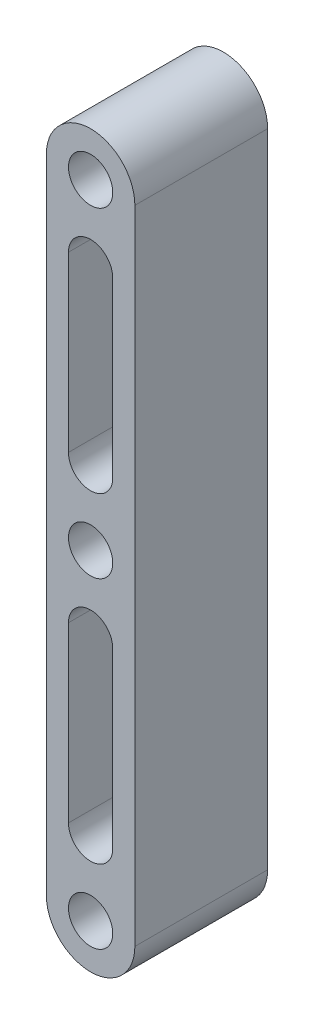
ISO-10303-21;
HEADER;
FILE_DESCRIPTION(('STEP AP214'),'2;1');
FILE_NAME('part.step','',(''),(''),'','','');
FILE_SCHEMA(('AUTOMOTIVE_DESIGN { 1 0 10303 214 1 1 1 1 }'));
ENDSEC;
DATA;
#1=APPLICATION_CONTEXT('core data for automotive mechanical design processes');
#2=APPLICATION_PROTOCOL_DEFINITION('international standard','automotive_design',2000,#1);
#3=PRODUCT_CONTEXT('',#1,'mechanical');
#4=PRODUCT('Part','Part','',(#3));
#5=PRODUCT_RELATED_PRODUCT_CATEGORY('part','',(#4));
#6=PRODUCT_DEFINITION_FORMATION('','',#4);
#7=PRODUCT_DEFINITION_CONTEXT('part definition',#1,'design');
#8=PRODUCT_DEFINITION('design','',#6,#7);
#9=PRODUCT_DEFINITION_SHAPE('','',#8);
#10=(LENGTH_UNIT() NAMED_UNIT(*) SI_UNIT(.MILLI.,.METRE.));
#11=(NAMED_UNIT(*) PLANE_ANGLE_UNIT() SI_UNIT($,.RADIAN.));
#12=(NAMED_UNIT(*) SI_UNIT($,.STERADIAN.) SOLID_ANGLE_UNIT());
#13=UNCERTAINTY_MEASURE_WITH_UNIT(LENGTH_MEASURE(1.E-05),#10,'distance_accuracy_value','');
#14=(GEOMETRIC_REPRESENTATION_CONTEXT(3) GLOBAL_UNCERTAINTY_ASSIGNED_CONTEXT((#13)) GLOBAL_UNIT_ASSIGNED_CONTEXT((#10,
#11,#12)) REPRESENTATION_CONTEXT('',''));
#15=CARTESIAN_POINT('',(0.,0.,0.));
#16=DIRECTION('',(0.,0.,1.));
#17=DIRECTION('',(1.,0.,0.));
#18=AXIS2_PLACEMENT_3D('',#15,#16,#17);
#19=CARTESIAN_POINT('',(0.,0.,9.));
#20=DIRECTION('',(0.,0.,1.));
#21=DIRECTION('',(1.,0.,0.));
#22=AXIS2_PLACEMENT_3D('',#19,#20,#21);
#23=PLANE('',#22);
#24=CARTESIAN_POINT('',(0.,0.,9.));
#25=DIRECTION('',(0.,0.,1.));
#26=DIRECTION('',(1.,0.,0.));
#27=AXIS2_PLACEMENT_3D('',#24,#25,#26);
#28=CIRCLE('',#27,3.);
#29=CARTESIAN_POINT('',(3.,0.,9.));
#30=VERTEX_POINT('',#29);
#31=EDGE_CURVE('E201',#30,#30,#28,.T.);
#32=ORIENTED_EDGE('',*,*,#31,.F.);
#33=EDGE_LOOP('',(#32));
#34=FACE_BOUND('',#33,.T.);
#35=CARTESIAN_POINT('',(0.,0.,9.));
#36=DIRECTION('',(0.,0.,1.));
#37=DIRECTION('',(1.,0.,0.));
#38=AXIS2_PLACEMENT_3D('',#35,#36,#37);
#39=CIRCLE('',#38,6.);
#40=CARTESIAN_POINT('',(6.,0.,9.));
#41=VERTEX_POINT('',#40);
#42=CARTESIAN_POINT('',(-6.,0.,9.));
#43=VERTEX_POINT('',#42);
#44=EDGE_CURVE('E213',#41,#43,#39,.T.);
#45=ORIENTED_EDGE('',*,*,#44,.T.);
#46=DIRECTION('',(0.,-1.,0.));
#47=VECTOR('',#46,1.);
#48=CARTESIAN_POINT('',(-6.,0.,9.));
#49=LINE('',#48,#47);
#50=CARTESIAN_POINT('',(-6.,-87.,9.));
#51=VERTEX_POINT('',#50);
#52=EDGE_CURVE('E216',#43,#51,#49,.T.);
#53=ORIENTED_EDGE('',*,*,#52,.T.);
#54=CARTESIAN_POINT('',(0.,-87.,9.));
#55=DIRECTION('',(0.,0.,1.));
#56=DIRECTION('',(1.,0.,0.));
#57=AXIS2_PLACEMENT_3D('',#54,#55,#56);
#58=CIRCLE('',#57,6.);
#59=CARTESIAN_POINT('',(6.00000000000001,-87.,9.));
#60=VERTEX_POINT('',#59);
#61=EDGE_CURVE('E219',#51,#60,#58,.T.);
#62=ORIENTED_EDGE('',*,*,#61,.T.);
#63=DIRECTION('',(0.,1.,0.));
#64=VECTOR('',#63,1.);
#65=CARTESIAN_POINT('',(6.,0.,9.));
#66=LINE('',#65,#64);
#67=EDGE_CURVE('E221',#60,#41,#66,.T.);
#68=ORIENTED_EDGE('',*,*,#67,.T.);
#69=EDGE_LOOP('',(#45,#53,#62,#68));
#70=FACE_BOUND('',#69,.T.);
#71=CARTESIAN_POINT('',(0.,-87.,9.));
#72=DIRECTION('',(0.,0.,1.));
#73=DIRECTION('',(1.,0.,0.));
#74=AXIS2_PLACEMENT_3D('',#71,#72,#73);
#75=CIRCLE('',#74,3.);
#76=CARTESIAN_POINT('',(3.00000000000001,-87.,9.));
#77=VERTEX_POINT('',#76);
#78=EDGE_CURVE('E207',#77,#77,#75,.T.);
#79=ORIENTED_EDGE('',*,*,#78,.F.);
#80=EDGE_LOOP('',(#79));
#81=FACE_BOUND('',#80,.T.);
#82=CARTESIAN_POINT('',(0.,-43.5,9.));
#83=DIRECTION('',(0.,0.,1.));
#84=DIRECTION('',(1.,0.,0.));
#85=AXIS2_PLACEMENT_3D('',#82,#83,#84);
#86=CIRCLE('',#85,3.);
#87=CARTESIAN_POINT('',(3.00000000000001,-43.5,9.));
#88=VERTEX_POINT('',#87);
#89=EDGE_CURVE('E195',#88,#88,#86,.T.);
#90=ORIENTED_EDGE('',*,*,#89,.F.);
#91=EDGE_LOOP('',(#90));
#92=FACE_BOUND('',#91,.T.);
#93=DIRECTION('',(0.,-1.,0.));
#94=VECTOR('',#93,1.);
#95=CARTESIAN_POINT('',(-3.,-10.,9.));
#96=LINE('',#95,#94);
#97=CARTESIAN_POINT('',(-3.,-10.,9.));
#98=VERTEX_POINT('',#97);
#99=CARTESIAN_POINT('',(-3.,-33.5,9.));
#100=VERTEX_POINT('',#99);
#101=EDGE_CURVE('E166',#98,#100,#96,.T.);
#102=ORIENTED_EDGE('',*,*,#101,.F.);
#103=CARTESIAN_POINT('',(0.,-10.,9.));
#104=DIRECTION('',(0.,0.,1.));
#105=DIRECTION('',(1.,0.,0.));
#106=AXIS2_PLACEMENT_3D('',#103,#104,#105);
#107=CIRCLE('',#106,3.);
#108=CARTESIAN_POINT('',(3.,-10.,9.));
#109=VERTEX_POINT('',#108);
#110=EDGE_CURVE('E164',#109,#98,#107,.T.);
#111=ORIENTED_EDGE('',*,*,#110,.F.);
#112=DIRECTION('',(0.,1.,0.));
#113=VECTOR('',#112,1.);
#114=CARTESIAN_POINT('',(3.,-10.,9.));
#115=LINE('',#114,#113);
#116=CARTESIAN_POINT('',(3.,-33.5,9.));
#117=VERTEX_POINT('',#116);
#118=EDGE_CURVE('E172',#117,#109,#115,.T.);
#119=ORIENTED_EDGE('',*,*,#118,.F.);
#120=CARTESIAN_POINT('',(0.,-33.5,9.));
#121=DIRECTION('',(0.,0.,1.));
#122=DIRECTION('',(1.,0.,0.));
#123=AXIS2_PLACEMENT_3D('',#120,#121,#122);
#124=CIRCLE('',#123,3.);
#125=EDGE_CURVE('E169',#100,#117,#124,.T.);
#126=ORIENTED_EDGE('',*,*,#125,.F.);
#127=EDGE_LOOP('',(#102,#111,#119,#126));
#128=FACE_BOUND('',#127,.T.);
#129=DIRECTION('',(0.,-1.,0.));
#130=VECTOR('',#129,1.);
#131=CARTESIAN_POINT('',(-2.99999999999999,-53.5,9.));
#132=LINE('',#131,#130);
#133=CARTESIAN_POINT('',(-2.99999999999999,-53.5,9.));
#134=VERTEX_POINT('',#133);
#135=CARTESIAN_POINT('',(-2.99999999999999,-77.,9.));
#136=VERTEX_POINT('',#135);
#137=EDGE_CURVE('E136',#134,#136,#132,.T.);
#138=ORIENTED_EDGE('',*,*,#137,.F.);
#139=CARTESIAN_POINT('',(0.,-53.5,9.));
#140=DIRECTION('',(0.,0.,1.));
#141=DIRECTION('',(1.,0.,0.));
#142=AXIS2_PLACEMENT_3D('',#139,#140,#141);
#143=CIRCLE('',#142,3.);
#144=CARTESIAN_POINT('',(3.00000000000001,-53.5,9.));
#145=VERTEX_POINT('',#144);
#146=EDGE_CURVE('E128',#145,#134,#143,.T.);
#147=ORIENTED_EDGE('',*,*,#146,.F.);
#148=DIRECTION('',(0.,1.,0.));
#149=VECTOR('',#148,1.);
#150=CARTESIAN_POINT('',(3.00000000000001,-53.5,9.));
#151=LINE('',#150,#149);
#152=CARTESIAN_POINT('',(3.00000000000001,-77.,9.));
#153=VERTEX_POINT('',#152);
#154=EDGE_CURVE('E150',#153,#145,#151,.T.);
#155=ORIENTED_EDGE('',*,*,#154,.F.);
#156=CARTESIAN_POINT('',(0.,-77.,9.));
#157=DIRECTION('',(0.,0.,1.));
#158=DIRECTION('',(1.,0.,0.));
#159=AXIS2_PLACEMENT_3D('',#156,#157,#158);
#160=CIRCLE('',#159,3.);
#161=EDGE_CURVE('E148',#136,#153,#160,.T.);
#162=ORIENTED_EDGE('',*,*,#161,.F.);
#163=EDGE_LOOP('',(#138,#147,#155,#162));
#164=FACE_BOUND('',#163,.T.);
#165=ADVANCED_FACE('F39',(#34,#70,#81,#92,#128,#164),#23,.T.);
#166=CARTESIAN_POINT('',(0.,0.,-9.));
#167=DIRECTION('',(0.,0.,1.));
#168=DIRECTION('',(1.,0.,0.));
#169=AXIS2_PLACEMENT_3D('',#166,#167,#168);
#170=PLANE('',#169);
#171=CARTESIAN_POINT('',(0.,-10.,-9.));
#172=DIRECTION('',(0.,0.,1.));
#173=DIRECTION('',(1.,0.,0.));
#174=AXIS2_PLACEMENT_3D('',#171,#172,#173);
#175=CIRCLE('',#174,3.);
#176=CARTESIAN_POINT('',(3.,-10.,-9.));
#177=VERTEX_POINT('',#176);
#178=CARTESIAN_POINT('',(-3.,-10.,-9.));
#179=VERTEX_POINT('',#178);
#180=EDGE_CURVE('E144',#177,#179,#175,.T.);
#181=ORIENTED_EDGE('',*,*,#180,.T.);
#182=DIRECTION('',(0.,-1.,0.));
#183=VECTOR('',#182,1.);
#184=CARTESIAN_POINT('',(-3.,-10.,-9.));
#185=LINE('',#184,#183);
#186=CARTESIAN_POINT('',(-3.,-33.5,-9.));
#187=VERTEX_POINT('',#186);
#188=EDGE_CURVE('E177',#179,#187,#185,.T.);
#189=ORIENTED_EDGE('',*,*,#188,.T.);
#190=CARTESIAN_POINT('',(0.,-33.5,-9.));
#191=DIRECTION('',(0.,0.,1.));
#192=DIRECTION('',(1.,0.,0.));
#193=AXIS2_PLACEMENT_3D('',#190,#191,#192);
#194=CIRCLE('',#193,3.);
#195=CARTESIAN_POINT('',(3.,-33.5,-9.));
#196=VERTEX_POINT('',#195);
#197=EDGE_CURVE('E180',#187,#196,#194,.T.);
#198=ORIENTED_EDGE('',*,*,#197,.T.);
#199=DIRECTION('',(0.,1.,0.));
#200=VECTOR('',#199,1.);
#201=CARTESIAN_POINT('',(3.,-10.,-9.));
#202=LINE('',#201,#200);
#203=EDGE_CURVE('E167',#196,#177,#202,.T.);
#204=ORIENTED_EDGE('',*,*,#203,.T.);
#205=EDGE_LOOP('',(#181,#189,#198,#204));
#206=FACE_BOUND('',#205,.T.);
#207=CARTESIAN_POINT('',(0.,0.,-9.));
#208=DIRECTION('',(0.,0.,1.));
#209=DIRECTION('',(1.,0.,0.));
#210=AXIS2_PLACEMENT_3D('',#207,#208,#209);
#211=CIRCLE('',#210,6.);
#212=CARTESIAN_POINT('',(6.,0.,-9.));
#213=VERTEX_POINT('',#212);
#214=CARTESIAN_POINT('',(-6.,0.,-9.));
#215=VERTEX_POINT('',#214);
#216=EDGE_CURVE('E210',#213,#215,#211,.T.);
#217=ORIENTED_EDGE('',*,*,#216,.F.);
#218=DIRECTION('',(0.,1.,0.));
#219=VECTOR('',#218,1.);
#220=CARTESIAN_POINT('',(6.,0.,-9.));
#221=LINE('',#220,#219);
#222=CARTESIAN_POINT('',(6.00000000000001,-87.,-9.));
#223=VERTEX_POINT('',#222);
#224=EDGE_CURVE('E217',#223,#213,#221,.T.);
#225=ORIENTED_EDGE('',*,*,#224,.F.);
#226=CARTESIAN_POINT('',(0.,-87.,-9.));
#227=DIRECTION('',(0.,0.,1.));
#228=DIRECTION('',(1.,0.,0.));
#229=AXIS2_PLACEMENT_3D('',#226,#227,#228);
#230=CIRCLE('',#229,6.);
#231=CARTESIAN_POINT('',(-6.,-87.,-9.));
#232=VERTEX_POINT('',#231);
#233=EDGE_CURVE('E228',#232,#223,#230,.T.);
#234=ORIENTED_EDGE('',*,*,#233,.F.);
#235=DIRECTION('',(0.,-1.,0.));
#236=VECTOR('',#235,1.);
#237=CARTESIAN_POINT('',(-6.,0.,-9.));
#238=LINE('',#237,#236);
#239=EDGE_CURVE('E226',#215,#232,#238,.T.);
#240=ORIENTED_EDGE('',*,*,#239,.F.);
#241=EDGE_LOOP('',(#217,#225,#234,#240));
#242=FACE_BOUND('',#241,.T.);
#243=CARTESIAN_POINT('',(0.,-87.,-9.));
#244=DIRECTION('',(0.,0.,1.));
#245=DIRECTION('',(1.,0.,0.));
#246=AXIS2_PLACEMENT_3D('',#243,#244,#245);
#247=CIRCLE('',#246,3.);
#248=CARTESIAN_POINT('',(3.00000000000001,-87.,-9.));
#249=VERTEX_POINT('',#248);
#250=EDGE_CURVE('E204',#249,#249,#247,.T.);
#251=ORIENTED_EDGE('',*,*,#250,.T.);
#252=EDGE_LOOP('',(#251));
#253=FACE_BOUND('',#252,.T.);
#254=CARTESIAN_POINT('',(0.,0.,-9.));
#255=DIRECTION('',(0.,0.,1.));
#256=DIRECTION('',(1.,0.,0.));
#257=AXIS2_PLACEMENT_3D('',#254,#255,#256);
#258=CIRCLE('',#257,3.);
#259=CARTESIAN_POINT('',(3.,0.,-9.));
#260=VERTEX_POINT('',#259);
#261=EDGE_CURVE('E198',#260,#260,#258,.T.);
#262=ORIENTED_EDGE('',*,*,#261,.T.);
#263=EDGE_LOOP('',(#262));
#264=FACE_BOUND('',#263,.T.);
#265=CARTESIAN_POINT('',(0.,-43.5,-9.));
#266=DIRECTION('',(0.,0.,1.));
#267=DIRECTION('',(1.,0.,0.));
#268=AXIS2_PLACEMENT_3D('',#265,#266,#267);
#269=CIRCLE('',#268,3.);
#270=CARTESIAN_POINT('',(3.00000000000001,-43.5,-9.));
#271=VERTEX_POINT('',#270);
#272=EDGE_CURVE('E194',#271,#271,#269,.T.);
#273=ORIENTED_EDGE('',*,*,#272,.T.);
#274=EDGE_LOOP('',(#273));
#275=FACE_BOUND('',#274,.T.);
#276=CARTESIAN_POINT('',(0.,-53.5,-9.));
#277=DIRECTION('',(0.,0.,1.));
#278=DIRECTION('',(1.,0.,0.));
#279=AXIS2_PLACEMENT_3D('',#276,#277,#278);
#280=CIRCLE('',#279,3.);
#281=CARTESIAN_POINT('',(3.00000000000001,-53.5,-9.));
#282=VERTEX_POINT('',#281);
#283=CARTESIAN_POINT('',(-2.99999999999999,-53.5,-9.));
#284=VERTEX_POINT('',#283);
#285=EDGE_CURVE('E62',#282,#284,#280,.T.);
#286=ORIENTED_EDGE('',*,*,#285,.T.);
#287=DIRECTION('',(0.,-1.,0.));
#288=VECTOR('',#287,1.);
#289=CARTESIAN_POINT('',(-2.99999999999999,-53.5,-9.));
#290=LINE('',#289,#288);
#291=CARTESIAN_POINT('',(-2.99999999999999,-77.,-9.));
#292=VERTEX_POINT('',#291);
#293=EDGE_CURVE('E143',#284,#292,#290,.T.);
#294=ORIENTED_EDGE('',*,*,#293,.T.);
#295=CARTESIAN_POINT('',(0.,-77.,-9.));
#296=DIRECTION('',(0.,0.,1.));
#297=DIRECTION('',(1.,0.,0.));
#298=AXIS2_PLACEMENT_3D('',#295,#296,#297);
#299=CIRCLE('',#298,3.);
#300=CARTESIAN_POINT('',(3.00000000000001,-77.,-9.));
#301=VERTEX_POINT('',#300);
#302=EDGE_CURVE('E156',#292,#301,#299,.T.);
#303=ORIENTED_EDGE('',*,*,#302,.T.);
#304=DIRECTION('',(0.,1.,0.));
#305=VECTOR('',#304,1.);
#306=CARTESIAN_POINT('',(3.00000000000001,-53.5,-9.));
#307=LINE('',#306,#305);
#308=EDGE_CURVE('E137',#301,#282,#307,.T.);
#309=ORIENTED_EDGE('',*,*,#308,.T.);
#310=EDGE_LOOP('',(#286,#294,#303,#309));
#311=FACE_BOUND('',#310,.T.);
#312=ADVANCED_FACE('F246',(#206,#242,#253,#264,#275,#311),#170,.F.);
#313=CARTESIAN_POINT('',(0.,0.,9.));
#314=DIRECTION('',(0.,0.,-1.));
#315=DIRECTION('',(-1.,0.,0.));
#316=AXIS2_PLACEMENT_3D('',#313,#314,#315);
#317=CYLINDRICAL_SURFACE('',#316,6.);
#318=ORIENTED_EDGE('',*,*,#216,.T.);
#319=DIRECTION('',(0.,0.,-1.));
#320=VECTOR('',#319,1.);
#321=CARTESIAN_POINT('',(-6.,0.,9.));
#322=LINE('',#321,#320);
#323=EDGE_CURVE('E11',#43,#215,#322,.T.);
#324=ORIENTED_EDGE('',*,*,#323,.F.);
#325=ORIENTED_EDGE('',*,*,#44,.F.);
#326=DIRECTION('',(0.,0.,-1.));
#327=VECTOR('',#326,1.);
#328=CARTESIAN_POINT('',(6.,0.,9.));
#329=LINE('',#328,#327);
#330=EDGE_CURVE('E223',#41,#213,#329,.T.);
#331=ORIENTED_EDGE('',*,*,#330,.T.);
#332=EDGE_LOOP('',(#318,#324,#325,#331));
#333=FACE_BOUND('',#332,.T.);
#334=ADVANCED_FACE('F41',(#333),#317,.T.);
#335=CARTESIAN_POINT('',(-6.,0.,9.));
#336=DIRECTION('',(1.,0.,0.));
#337=DIRECTION('',(0.,1.,0.));
#338=AXIS2_PLACEMENT_3D('',#335,#336,#337);
#339=PLANE('',#338);
#340=ORIENTED_EDGE('',*,*,#239,.T.);
#341=DIRECTION('',(0.,0.,-1.));
#342=VECTOR('',#341,1.);
#343=CARTESIAN_POINT('',(-6.,-87.,9.));
#344=LINE('',#343,#342);
#345=EDGE_CURVE('E47',#51,#232,#344,.T.);
#346=ORIENTED_EDGE('',*,*,#345,.F.);
#347=ORIENTED_EDGE('',*,*,#52,.F.);
#348=ORIENTED_EDGE('',*,*,#323,.T.);
#349=EDGE_LOOP('',(#340,#346,#347,#348));
#350=FACE_BOUND('',#349,.T.);
#351=ADVANCED_FACE('F257',(#350),#339,.F.);
#352=CARTESIAN_POINT('',(0.,-87.,9.));
#353=DIRECTION('',(0.,0.,-1.));
#354=DIRECTION('',(-1.,0.,0.));
#355=AXIS2_PLACEMENT_3D('',#352,#353,#354);
#356=CYLINDRICAL_SURFACE('',#355,6.);
#357=ORIENTED_EDGE('',*,*,#233,.T.);
#358=DIRECTION('',(0.,0.,-1.));
#359=VECTOR('',#358,1.);
#360=CARTESIAN_POINT('',(6.00000000000001,-87.,9.));
#361=LINE('',#360,#359);
#362=EDGE_CURVE('E233',#60,#223,#361,.T.);
#363=ORIENTED_EDGE('',*,*,#362,.F.);
#364=ORIENTED_EDGE('',*,*,#61,.F.);
#365=ORIENTED_EDGE('',*,*,#345,.T.);
#366=EDGE_LOOP('',(#357,#363,#364,#365));
#367=FACE_BOUND('',#366,.T.);
#368=ADVANCED_FACE('F240',(#367),#356,.T.);
#369=CARTESIAN_POINT('',(6.,0.,9.));
#370=DIRECTION('',(-1.,0.,0.));
#371=DIRECTION('',(0.,-1.,0.));
#372=AXIS2_PLACEMENT_3D('',#369,#370,#371);
#373=PLANE('',#372);
#374=ORIENTED_EDGE('',*,*,#224,.T.);
#375=ORIENTED_EDGE('',*,*,#330,.F.);
#376=ORIENTED_EDGE('',*,*,#67,.F.);
#377=ORIENTED_EDGE('',*,*,#362,.T.);
#378=EDGE_LOOP('',(#374,#375,#376,#377));
#379=FACE_BOUND('',#378,.T.);
#380=ADVANCED_FACE('F250',(#379),#373,.F.);
#381=CARTESIAN_POINT('',(0.,-87.,9.));
#382=DIRECTION('',(0.,0.,-1.));
#383=DIRECTION('',(-1.,0.,0.));
#384=AXIS2_PLACEMENT_3D('',#381,#382,#383);
#385=CYLINDRICAL_SURFACE('',#384,3.);
#386=ORIENTED_EDGE('',*,*,#78,.T.);
#387=EDGE_LOOP('',(#386));
#388=FACE_BOUND('',#387,.T.);
#389=ORIENTED_EDGE('',*,*,#250,.F.);
#390=EDGE_LOOP('',(#389));
#391=FACE_BOUND('',#390,.T.);
#392=ADVANCED_FACE('F274',(#388,#391),#385,.F.);
#393=CARTESIAN_POINT('',(0.,0.,9.));
#394=DIRECTION('',(0.,0.,-1.));
#395=DIRECTION('',(-1.,0.,0.));
#396=AXIS2_PLACEMENT_3D('',#393,#394,#395);
#397=CYLINDRICAL_SURFACE('',#396,3.);
#398=ORIENTED_EDGE('',*,*,#31,.T.);
#399=EDGE_LOOP('',(#398));
#400=FACE_BOUND('',#399,.T.);
#401=ORIENTED_EDGE('',*,*,#261,.F.);
#402=EDGE_LOOP('',(#401));
#403=FACE_BOUND('',#402,.T.);
#404=ADVANCED_FACE('F281',(#400,#403),#397,.F.);
#405=CARTESIAN_POINT('',(0.,-43.5,9.));
#406=DIRECTION('',(0.,0.,-1.));
#407=DIRECTION('',(-1.,0.,0.));
#408=AXIS2_PLACEMENT_3D('',#405,#406,#407);
#409=CYLINDRICAL_SURFACE('',#408,3.);
#410=ORIENTED_EDGE('',*,*,#89,.T.);
#411=EDGE_LOOP('',(#410));
#412=FACE_BOUND('',#411,.T.);
#413=ORIENTED_EDGE('',*,*,#272,.F.);
#414=EDGE_LOOP('',(#413));
#415=FACE_BOUND('',#414,.T.);
#416=ADVANCED_FACE('F286',(#412,#415),#409,.F.);
#417=CARTESIAN_POINT('',(0.,-10.,9.));
#418=DIRECTION('',(0.,0.,-1.));
#419=DIRECTION('',(-1.,0.,0.));
#420=AXIS2_PLACEMENT_3D('',#417,#418,#419);
#421=CYLINDRICAL_SURFACE('',#420,3.);
#422=ORIENTED_EDGE('',*,*,#180,.F.);
#423=DIRECTION('',(0.,0.,-1.));
#424=VECTOR('',#423,1.);
#425=CARTESIAN_POINT('',(3.,-10.,9.));
#426=LINE('',#425,#424);
#427=EDGE_CURVE('E174',#109,#177,#426,.T.);
#428=ORIENTED_EDGE('',*,*,#427,.F.);
#429=ORIENTED_EDGE('',*,*,#110,.T.);
#430=DIRECTION('',(0.,0.,-1.));
#431=VECTOR('',#430,1.);
#432=CARTESIAN_POINT('',(-3.,-10.,9.));
#433=LINE('',#432,#431);
#434=EDGE_CURVE('E191',#98,#179,#433,.T.);
#435=ORIENTED_EDGE('',*,*,#434,.T.);
#436=EDGE_LOOP('',(#422,#428,#429,#435));
#437=FACE_BOUND('',#436,.T.);
#438=ADVANCED_FACE('F322',(#437),#421,.F.);
#439=CARTESIAN_POINT('',(-3.,-10.,9.));
#440=DIRECTION('',(1.,0.,0.));
#441=DIRECTION('',(0.,1.,0.));
#442=AXIS2_PLACEMENT_3D('',#439,#440,#441);
#443=PLANE('',#442);
#444=ORIENTED_EDGE('',*,*,#188,.F.);
#445=ORIENTED_EDGE('',*,*,#434,.F.);
#446=ORIENTED_EDGE('',*,*,#101,.T.);
#447=DIRECTION('',(0.,0.,-1.));
#448=VECTOR('',#447,1.);
#449=CARTESIAN_POINT('',(-3.,-33.5,9.));
#450=LINE('',#449,#448);
#451=EDGE_CURVE('E189',#100,#187,#450,.T.);
#452=ORIENTED_EDGE('',*,*,#451,.T.);
#453=EDGE_LOOP('',(#444,#445,#446,#452));
#454=FACE_BOUND('',#453,.T.);
#455=ADVANCED_FACE('F318',(#454),#443,.T.);
#456=CARTESIAN_POINT('',(0.,-33.5,9.));
#457=DIRECTION('',(0.,0.,-1.));
#458=DIRECTION('',(-1.,0.,0.));
#459=AXIS2_PLACEMENT_3D('',#456,#457,#458);
#460=CYLINDRICAL_SURFACE('',#459,3.);
#461=ORIENTED_EDGE('',*,*,#197,.F.);
#462=ORIENTED_EDGE('',*,*,#451,.F.);
#463=ORIENTED_EDGE('',*,*,#125,.T.);
#464=DIRECTION('',(0.,0.,-1.));
#465=VECTOR('',#464,1.);
#466=CARTESIAN_POINT('',(3.,-33.5,9.));
#467=LINE('',#466,#465);
#468=EDGE_CURVE('E187',#117,#196,#467,.T.);
#469=ORIENTED_EDGE('',*,*,#468,.T.);
#470=EDGE_LOOP('',(#461,#462,#463,#469));
#471=FACE_BOUND('',#470,.T.);
#472=ADVANCED_FACE('F314',(#471),#460,.F.);
#473=CARTESIAN_POINT('',(3.,-10.,9.));
#474=DIRECTION('',(-1.,0.,0.));
#475=DIRECTION('',(0.,-1.,0.));
#476=AXIS2_PLACEMENT_3D('',#473,#474,#475);
#477=PLANE('',#476);
#478=ORIENTED_EDGE('',*,*,#203,.F.);
#479=ORIENTED_EDGE('',*,*,#468,.F.);
#480=ORIENTED_EDGE('',*,*,#118,.T.);
#481=ORIENTED_EDGE('',*,*,#427,.T.);
#482=EDGE_LOOP('',(#478,#479,#480,#481));
#483=FACE_BOUND('',#482,.T.);
#484=ADVANCED_FACE('F311',(#483),#477,.T.);
#485=CARTESIAN_POINT('',(0.,-53.5,9.));
#486=DIRECTION('',(0.,0.,-1.));
#487=DIRECTION('',(-1.,0.,0.));
#488=AXIS2_PLACEMENT_3D('',#485,#486,#487);
#489=CYLINDRICAL_SURFACE('',#488,3.);
#490=ORIENTED_EDGE('',*,*,#285,.F.);
#491=DIRECTION('',(0.,0.,-1.));
#492=VECTOR('',#491,1.);
#493=CARTESIAN_POINT('',(3.00000000000001,-53.5,9.));
#494=LINE('',#493,#492);
#495=EDGE_CURVE('E132',#145,#282,#494,.T.);
#496=ORIENTED_EDGE('',*,*,#495,.F.);
#497=ORIENTED_EDGE('',*,*,#146,.T.);
#498=DIRECTION('',(0.,0.,-1.));
#499=VECTOR('',#498,1.);
#500=CARTESIAN_POINT('',(-2.99999999999999,-53.5,9.));
#501=LINE('',#500,#499);
#502=EDGE_CURVE('E131',#134,#284,#501,.T.);
#503=ORIENTED_EDGE('',*,*,#502,.T.);
#504=EDGE_LOOP('',(#490,#496,#497,#503));
#505=FACE_BOUND('',#504,.T.);
#506=ADVANCED_FACE('F130',(#505),#489,.F.);
#507=CARTESIAN_POINT('',(-2.99999999999999,-53.5,9.));
#508=DIRECTION('',(1.,0.,0.));
#509=DIRECTION('',(0.,1.,0.));
#510=AXIS2_PLACEMENT_3D('',#507,#508,#509);
#511=PLANE('',#510);
#512=ORIENTED_EDGE('',*,*,#293,.F.);
#513=ORIENTED_EDGE('',*,*,#502,.F.);
#514=ORIENTED_EDGE('',*,*,#137,.T.);
#515=DIRECTION('',(0.,0.,-1.));
#516=VECTOR('',#515,1.);
#517=CARTESIAN_POINT('',(-2.99999999999999,-77.,9.));
#518=LINE('',#517,#516);
#519=EDGE_CURVE('E145',#136,#292,#518,.T.);
#520=ORIENTED_EDGE('',*,*,#519,.T.);
#521=EDGE_LOOP('',(#512,#513,#514,#520));
#522=FACE_BOUND('',#521,.T.);
#523=ADVANCED_FACE('F140',(#522),#511,.T.);
#524=CARTESIAN_POINT('',(0.,-77.,9.));
#525=DIRECTION('',(0.,0.,-1.));
#526=DIRECTION('',(-1.,0.,0.));
#527=AXIS2_PLACEMENT_3D('',#524,#525,#526);
#528=CYLINDRICAL_SURFACE('',#527,3.);
#529=ORIENTED_EDGE('',*,*,#302,.F.);
#530=ORIENTED_EDGE('',*,*,#519,.F.);
#531=ORIENTED_EDGE('',*,*,#161,.T.);
#532=DIRECTION('',(0.,0.,-1.));
#533=VECTOR('',#532,1.);
#534=CARTESIAN_POINT('',(3.00000000000001,-77.,9.));
#535=LINE('',#534,#533);
#536=EDGE_CURVE('E54',#153,#301,#535,.T.);
#537=ORIENTED_EDGE('',*,*,#536,.T.);
#538=EDGE_LOOP('',(#529,#530,#531,#537));
#539=FACE_BOUND('',#538,.T.);
#540=ADVANCED_FACE('F299',(#539),#528,.F.);
#541=CARTESIAN_POINT('',(3.00000000000001,-53.5,9.));
#542=DIRECTION('',(-1.,0.,0.));
#543=DIRECTION('',(0.,-1.,0.));
#544=AXIS2_PLACEMENT_3D('',#541,#542,#543);
#545=PLANE('',#544);
#546=ORIENTED_EDGE('',*,*,#308,.F.);
#547=ORIENTED_EDGE('',*,*,#536,.F.);
#548=ORIENTED_EDGE('',*,*,#154,.T.);
#549=ORIENTED_EDGE('',*,*,#495,.T.);
#550=EDGE_LOOP('',(#546,#547,#548,#549));
#551=FACE_BOUND('',#550,.T.);
#552=ADVANCED_FACE('F297',(#551),#545,.T.);
#553=CLOSED_SHELL('',(#165,#312,#334,#351,#368,#380,#392,#404,#416,#438,#455,#472,#484,#506,
#523,#540,#552));
#554=MANIFOLD_SOLID_BREP('B2',#553);
#555=ADVANCED_BREP_SHAPE_REPRESENTATION('',(#18,#554),#14);
#556=SHAPE_DEFINITION_REPRESENTATION(#9,#555);
ENDSEC;
END-ISO-10303-21;
